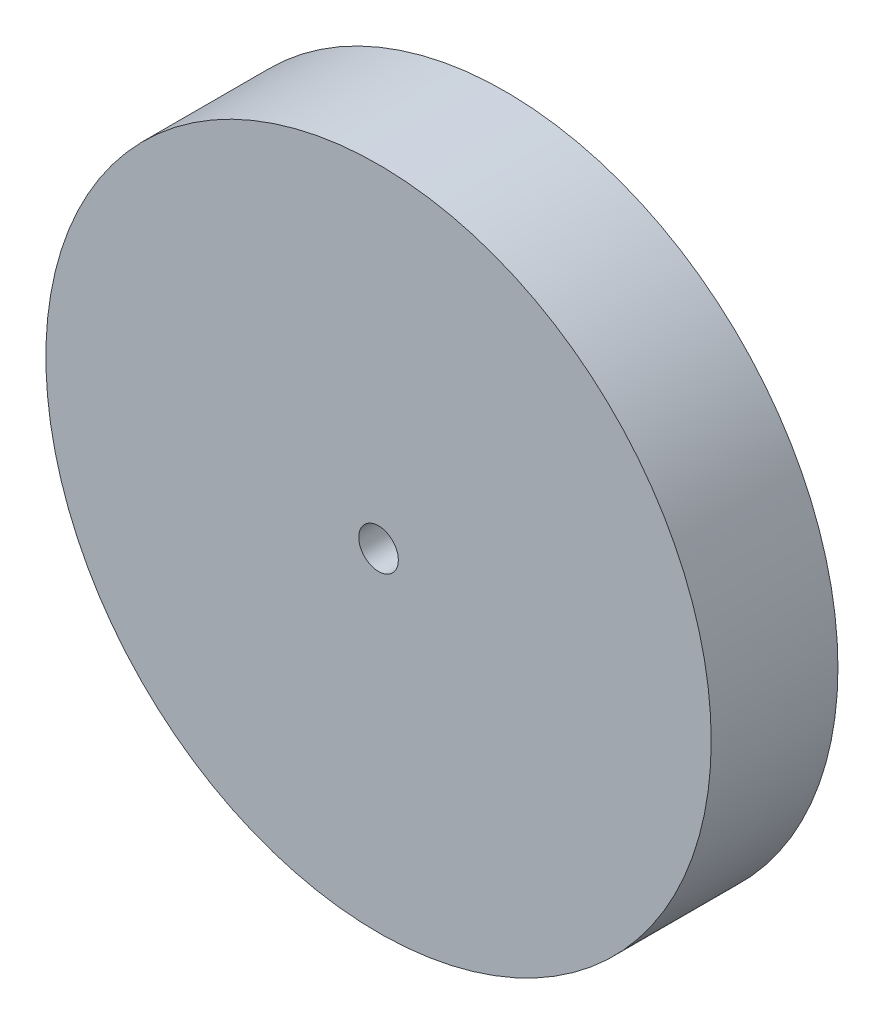
ISO-10303-21;
HEADER;
FILE_DESCRIPTION(('STEP AP214'),'2;1');
FILE_NAME('part.step','',(''),(''),'','','');
FILE_SCHEMA(('AUTOMOTIVE_DESIGN { 1 0 10303 214 1 1 1 1 }'));
ENDSEC;
DATA;
#1=APPLICATION_CONTEXT('core data for automotive mechanical design processes');
#2=APPLICATION_PROTOCOL_DEFINITION('international standard','automotive_design',2000,#1);
#3=PRODUCT_CONTEXT('',#1,'mechanical');
#4=PRODUCT('Part','Part','',(#3));
#5=PRODUCT_RELATED_PRODUCT_CATEGORY('part','',(#4));
#6=PRODUCT_DEFINITION_FORMATION('','',#4);
#7=PRODUCT_DEFINITION_CONTEXT('part definition',#1,'design');
#8=PRODUCT_DEFINITION('design','',#6,#7);
#9=PRODUCT_DEFINITION_SHAPE('','',#8);
#10=(LENGTH_UNIT() NAMED_UNIT(*) SI_UNIT(.MILLI.,.METRE.));
#11=(NAMED_UNIT(*) PLANE_ANGLE_UNIT() SI_UNIT($,.RADIAN.));
#12=(NAMED_UNIT(*) SI_UNIT($,.STERADIAN.) SOLID_ANGLE_UNIT());
#13=UNCERTAINTY_MEASURE_WITH_UNIT(LENGTH_MEASURE(1.E-05),#10,'distance_accuracy_value','');
#14=(GEOMETRIC_REPRESENTATION_CONTEXT(3) GLOBAL_UNCERTAINTY_ASSIGNED_CONTEXT((#13)) GLOBAL_UNIT_ASSIGNED_CONTEXT((#10,
#11,#12)) REPRESENTATION_CONTEXT('',''));
#15=CARTESIAN_POINT('',(0.,0.,0.));
#16=DIRECTION('',(0.,0.,1.));
#17=DIRECTION('',(1.,0.,0.));
#18=AXIS2_PLACEMENT_3D('',#15,#16,#17);
#19=CARTESIAN_POINT('',(0.,0.,8.));
#20=DIRECTION('',(0.,0.,-1.));
#21=DIRECTION('',(-1.,0.,0.));
#22=AXIS2_PLACEMENT_3D('',#19,#20,#21);
#23=CYLINDRICAL_SURFACE('',#22,21.);
#24=CARTESIAN_POINT('',(0.,0.,8.));
#25=DIRECTION('',(0.,0.,1.));
#26=DIRECTION('',(1.,0.,0.));
#27=AXIS2_PLACEMENT_3D('',#24,#25,#26);
#28=CIRCLE('',#27,21.);
#29=CARTESIAN_POINT('',(21.,0.,8.));
#30=VERTEX_POINT('',#29);
#31=EDGE_CURVE('E10',#30,#30,#28,.T.);
#32=ORIENTED_EDGE('',*,*,#31,.F.);
#33=EDGE_LOOP('',(#32));
#34=FACE_BOUND('',#33,.T.);
#35=CARTESIAN_POINT('',(0.,0.,0.));
#36=DIRECTION('',(0.,0.,1.));
#37=DIRECTION('',(1.,0.,0.));
#38=AXIS2_PLACEMENT_3D('',#35,#36,#37);
#39=CIRCLE('',#38,21.);
#40=CARTESIAN_POINT('',(21.,0.,0.));
#41=VERTEX_POINT('',#40);
#42=EDGE_CURVE('E46',#41,#41,#39,.T.);
#43=ORIENTED_EDGE('',*,*,#42,.T.);
#44=EDGE_LOOP('',(#43));
#45=FACE_BOUND('',#44,.T.);
#46=ADVANCED_FACE('F43',(#34,#45),#23,.T.);
#47=CARTESIAN_POINT('',(0.,0.,8.));
#48=DIRECTION('',(0.,0.,1.));
#49=DIRECTION('',(1.,0.,0.));
#50=AXIS2_PLACEMENT_3D('',#47,#48,#49);
#51=PLANE('',#50);
#52=CARTESIAN_POINT('',(0.,0.,8.));
#53=DIRECTION('',(0.,0.,1.));
#54=DIRECTION('',(1.,0.,0.));
#55=AXIS2_PLACEMENT_3D('',#52,#53,#54);
#56=CIRCLE('',#55,1.25);
#57=CARTESIAN_POINT('',(1.25,0.,8.));
#58=VERTEX_POINT('',#57);
#59=EDGE_CURVE('E57',#58,#58,#56,.T.);
#60=ORIENTED_EDGE('',*,*,#59,.F.);
#61=EDGE_LOOP('',(#60));
#62=FACE_BOUND('',#61,.T.);
#63=ORIENTED_EDGE('',*,*,#31,.T.);
#64=EDGE_LOOP('',(#63));
#65=FACE_BOUND('',#64,.T.);
#66=ADVANCED_FACE('F74',(#62,#65),#51,.T.);
#67=CARTESIAN_POINT('',(0.,0.,0.));
#68=DIRECTION('',(0.,0.,1.));
#69=DIRECTION('',(1.,0.,0.));
#70=AXIS2_PLACEMENT_3D('',#67,#68,#69);
#71=PLANE('',#70);
#72=CARTESIAN_POINT('',(0.,0.,0.));
#73=DIRECTION('',(0.,0.,1.));
#74=DIRECTION('',(1.,0.,0.));
#75=AXIS2_PLACEMENT_3D('',#72,#73,#74);
#76=CIRCLE('',#75,1.25);
#77=CARTESIAN_POINT('',(1.25,0.,0.));
#78=VERTEX_POINT('',#77);
#79=EDGE_CURVE('E55',#78,#78,#76,.T.);
#80=ORIENTED_EDGE('',*,*,#79,.T.);
#81=EDGE_LOOP('',(#80));
#82=FACE_BOUND('',#81,.T.);
#83=ORIENTED_EDGE('',*,*,#42,.F.);
#84=EDGE_LOOP('',(#83));
#85=FACE_BOUND('',#84,.T.);
#86=ADVANCED_FACE('F65',(#82,#85),#71,.F.);
#87=CARTESIAN_POINT('',(0.,0.,0.));
#88=DIRECTION('',(0.,0.,1.));
#89=DIRECTION('',(1.,0.,0.));
#90=AXIS2_PLACEMENT_3D('',#87,#88,#89);
#91=CYLINDRICAL_SURFACE('',#90,1.25);
#92=ORIENTED_EDGE('',*,*,#79,.F.);
#93=EDGE_LOOP('',(#92));
#94=FACE_BOUND('',#93,.T.);
#95=ORIENTED_EDGE('',*,*,#59,.T.);
#96=EDGE_LOOP('',(#95));
#97=FACE_BOUND('',#96,.T.);
#98=ADVANCED_FACE('F68',(#94,#97),#91,.F.);
#99=CLOSED_SHELL('',(#46,#66,#86,#98));
#100=MANIFOLD_SOLID_BREP('B2',#99);
#101=ADVANCED_BREP_SHAPE_REPRESENTATION('',(#18,#100),#14);
#102=SHAPE_DEFINITION_REPRESENTATION(#9,#101);
ENDSEC;
END-ISO-10303-21;
